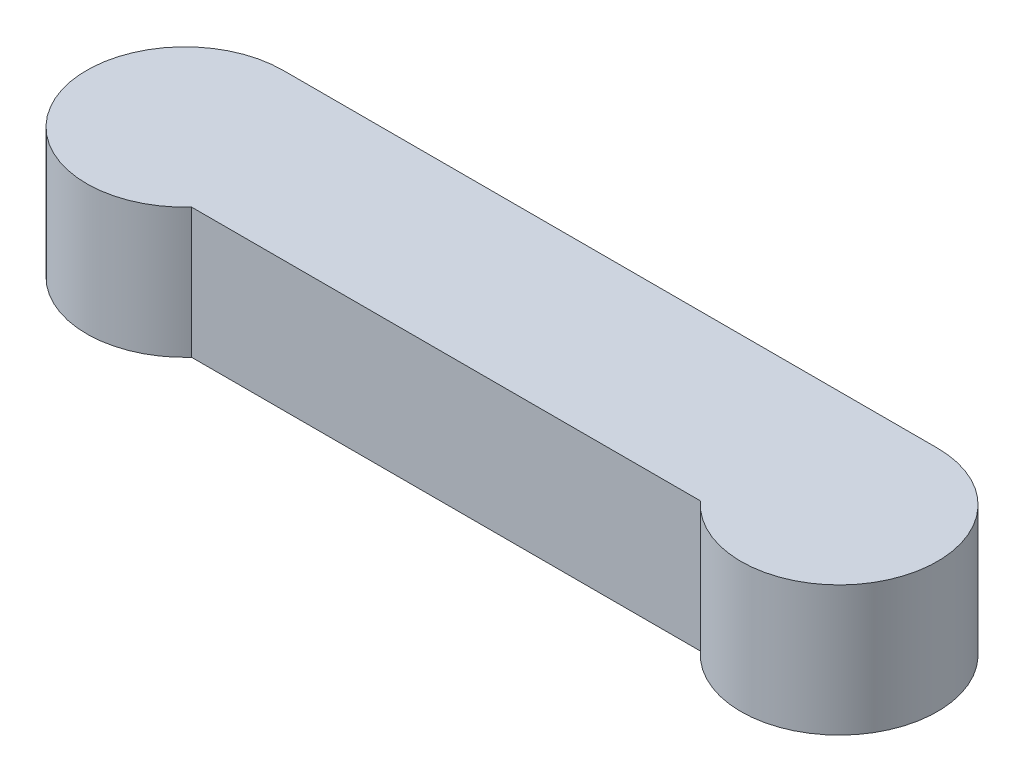
ISO-10303-21;
HEADER;
FILE_DESCRIPTION(('STEP AP214'),'2;1');
FILE_NAME('part.step','',(''),(''),'','','');
FILE_SCHEMA(('AUTOMOTIVE_DESIGN { 1 0 10303 214 1 1 1 1 }'));
ENDSEC;
DATA;
#1=APPLICATION_CONTEXT('core data for automotive mechanical design processes');
#2=APPLICATION_PROTOCOL_DEFINITION('international standard','automotive_design',2000,#1);
#3=PRODUCT_CONTEXT('',#1,'mechanical');
#4=PRODUCT('Part','Part','',(#3));
#5=PRODUCT_RELATED_PRODUCT_CATEGORY('part','',(#4));
#6=PRODUCT_DEFINITION_FORMATION('','',#4);
#7=PRODUCT_DEFINITION_CONTEXT('part definition',#1,'design');
#8=PRODUCT_DEFINITION('design','',#6,#7);
#9=PRODUCT_DEFINITION_SHAPE('','',#8);
#10=(LENGTH_UNIT() NAMED_UNIT(*) SI_UNIT(.MILLI.,.METRE.));
#11=(NAMED_UNIT(*) PLANE_ANGLE_UNIT() SI_UNIT($,.RADIAN.));
#12=(NAMED_UNIT(*) SI_UNIT($,.STERADIAN.) SOLID_ANGLE_UNIT());
#13=UNCERTAINTY_MEASURE_WITH_UNIT(LENGTH_MEASURE(1.E-05),#10,'distance_accuracy_value','');
#14=(GEOMETRIC_REPRESENTATION_CONTEXT(3) GLOBAL_UNCERTAINTY_ASSIGNED_CONTEXT((#13)) GLOBAL_UNIT_ASSIGNED_CONTEXT((#10,
#11,#12)) REPRESENTATION_CONTEXT('',''));
#15=CARTESIAN_POINT('',(0.,0.,0.));
#16=DIRECTION('',(0.,0.,1.));
#17=DIRECTION('',(1.,0.,0.));
#18=AXIS2_PLACEMENT_3D('',#15,#16,#17);
#19=CARTESIAN_POINT('',(-41.5000000000001,40.399999972,0.));
#20=DIRECTION('',(0.,-1.,0.));
#21=DIRECTION('',(0.,0.,-1.));
#22=AXIS2_PLACEMENT_3D('',#19,#20,#21);
#23=CYLINDRICAL_SURFACE('',#22,30.5);
#24=CARTESIAN_POINT('',(-41.5000000000001,0.,0.));
#25=DIRECTION('',(0.,1.,0.));
#26=DIRECTION('',(0.,0.,1.));
#27=AXIS2_PLACEMENT_3D('',#24,#25,#26);
#28=CIRCLE('',#27,30.5);
#29=CARTESIAN_POINT('',(-41.5000000000001,0.,-30.5));
#30=VERTEX_POINT('',#29);
#31=CARTESIAN_POINT('',(-18.9168204187277,0.,20.5));
#32=VERTEX_POINT('',#31);
#33=EDGE_CURVE('E96',#30,#32,#28,.T.);
#34=ORIENTED_EDGE('',*,*,#33,.T.);
#35=DIRECTION('',(0.,-1.,0.));
#36=VECTOR('',#35,1.);
#37=CARTESIAN_POINT('',(-18.9168204187277,40.399999972,20.5));
#38=LINE('',#37,#36);
#39=CARTESIAN_POINT('',(-18.9168204187277,40.399999972,20.5));
#40=VERTEX_POINT('',#39);
#41=EDGE_CURVE('E11',#40,#32,#38,.T.);
#42=ORIENTED_EDGE('',*,*,#41,.F.);
#43=CARTESIAN_POINT('',(-41.5000000000001,40.399999972,0.));
#44=DIRECTION('',(0.,1.,0.));
#45=DIRECTION('',(0.,0.,1.));
#46=AXIS2_PLACEMENT_3D('',#43,#44,#45);
#47=CIRCLE('',#46,30.5);
#48=CARTESIAN_POINT('',(-41.5000000000001,40.399999972,-30.5));
#49=VERTEX_POINT('',#48);
#50=EDGE_CURVE('E84',#49,#40,#47,.T.);
#51=ORIENTED_EDGE('',*,*,#50,.F.);
#52=DIRECTION('',(0.,-1.,0.));
#53=VECTOR('',#52,1.);
#54=CARTESIAN_POINT('',(-41.5000000000001,40.399999972,-30.5));
#55=LINE('',#54,#53);
#56=EDGE_CURVE('E92',#49,#30,#55,.T.);
#57=ORIENTED_EDGE('',*,*,#56,.T.);
#58=EDGE_LOOP('',(#34,#42,#51,#57));
#59=FACE_BOUND('',#58,.T.);
#60=ADVANCED_FACE('F33',(#59),#23,.T.);
#61=CARTESIAN_POINT('',(-18.9168204187277,40.399999972,20.5));
#62=DIRECTION('',(0.,0.,-1.));
#63=DIRECTION('',(-1.,0.,0.));
#64=AXIS2_PLACEMENT_3D('',#61,#62,#63);
#65=PLANE('',#64);
#66=DIRECTION('',(1.,0.,0.));
#67=VECTOR('',#66,1.);
#68=CARTESIAN_POINT('',(-18.9168204187277,0.,20.5));
#69=LINE('',#68,#67);
#70=CARTESIAN_POINT('',(139.116820418727,0.,20.5000000000001));
#71=VERTEX_POINT('',#70);
#72=EDGE_CURVE('E88',#32,#71,#69,.T.);
#73=ORIENTED_EDGE('',*,*,#72,.T.);
#74=DIRECTION('',(0.,-1.,0.));
#75=VECTOR('',#74,1.);
#76=CARTESIAN_POINT('',(139.116820418727,40.399999972,20.5000000000001));
#77=LINE('',#76,#75);
#78=CARTESIAN_POINT('',(139.116820418727,40.399999972,20.5000000000001));
#79=VERTEX_POINT('',#78);
#80=EDGE_CURVE('E41',#79,#71,#77,.T.);
#81=ORIENTED_EDGE('',*,*,#80,.F.);
#82=DIRECTION('',(1.,0.,0.));
#83=VECTOR('',#82,1.);
#84=CARTESIAN_POINT('',(-18.9168204187277,40.399999972,20.5));
#85=LINE('',#84,#83);
#86=EDGE_CURVE('E79',#40,#79,#85,.T.);
#87=ORIENTED_EDGE('',*,*,#86,.F.);
#88=ORIENTED_EDGE('',*,*,#41,.T.);
#89=EDGE_LOOP('',(#73,#81,#87,#88));
#90=FACE_BOUND('',#89,.T.);
#91=ADVANCED_FACE('F87',(#90),#65,.F.);
#92=CARTESIAN_POINT('',(161.7,40.399999972,0.));
#93=DIRECTION('',(0.,-1.,0.));
#94=DIRECTION('',(0.,0.,-1.));
#95=AXIS2_PLACEMENT_3D('',#92,#93,#94);
#96=CYLINDRICAL_SURFACE('',#95,30.5);
#97=CARTESIAN_POINT('',(161.7,0.,0.));
#98=DIRECTION('',(0.,1.,0.));
#99=DIRECTION('',(0.,0.,1.));
#100=AXIS2_PLACEMENT_3D('',#97,#98,#99);
#101=CIRCLE('',#100,30.5);
#102=CARTESIAN_POINT('',(161.7,0.,-30.4999999999999));
#103=VERTEX_POINT('',#102);
#104=EDGE_CURVE('E66',#71,#103,#101,.T.);
#105=ORIENTED_EDGE('',*,*,#104,.T.);
#106=DIRECTION('',(0.,-1.,0.));
#107=VECTOR('',#106,1.);
#108=CARTESIAN_POINT('',(161.7,40.399999972,-30.4999999999999));
#109=LINE('',#108,#107);
#110=CARTESIAN_POINT('',(161.7,40.399999972,-30.4999999999999));
#111=VERTEX_POINT('',#110);
#112=EDGE_CURVE('E89',#111,#103,#109,.T.);
#113=ORIENTED_EDGE('',*,*,#112,.F.);
#114=CARTESIAN_POINT('',(161.7,40.399999972,0.));
#115=DIRECTION('',(0.,1.,0.));
#116=DIRECTION('',(0.,0.,1.));
#117=AXIS2_PLACEMENT_3D('',#114,#115,#116);
#118=CIRCLE('',#117,30.5);
#119=EDGE_CURVE('E82',#79,#111,#118,.T.);
#120=ORIENTED_EDGE('',*,*,#119,.F.);
#121=ORIENTED_EDGE('',*,*,#80,.T.);
#122=EDGE_LOOP('',(#105,#113,#120,#121));
#123=FACE_BOUND('',#122,.T.);
#124=ADVANCED_FACE('F90',(#123),#96,.T.);
#125=CARTESIAN_POINT('',(161.7,40.399999972,-30.4999999999999));
#126=DIRECTION('',(0.,0.,1.));
#127=DIRECTION('',(1.,0.,0.));
#128=AXIS2_PLACEMENT_3D('',#125,#126,#127);
#129=PLANE('',#128);
#130=DIRECTION('',(-1.,0.,0.));
#131=VECTOR('',#130,1.);
#132=CARTESIAN_POINT('',(161.7,0.,-30.4999999999999));
#133=LINE('',#132,#131);
#134=EDGE_CURVE('E72',#103,#30,#133,.T.);
#135=ORIENTED_EDGE('',*,*,#134,.T.);
#136=ORIENTED_EDGE('',*,*,#56,.F.);
#137=DIRECTION('',(-1.,0.,0.));
#138=VECTOR('',#137,1.);
#139=CARTESIAN_POINT('',(161.7,40.399999972,-30.4999999999999));
#140=LINE('',#139,#138);
#141=EDGE_CURVE('E49',#111,#49,#140,.T.);
#142=ORIENTED_EDGE('',*,*,#141,.F.);
#143=ORIENTED_EDGE('',*,*,#112,.T.);
#144=EDGE_LOOP('',(#135,#136,#142,#143));
#145=FACE_BOUND('',#144,.T.);
#146=ADVANCED_FACE('F103',(#145),#129,.F.);
#147=CARTESIAN_POINT('',(-41.5000000000001,40.399999972,0.));
#148=DIRECTION('',(0.,1.,0.));
#149=DIRECTION('',(0.,0.,1.));
#150=AXIS2_PLACEMENT_3D('',#147,#148,#149);
#151=PLANE('',#150);
#152=ORIENTED_EDGE('',*,*,#50,.T.);
#153=ORIENTED_EDGE('',*,*,#86,.T.);
#154=ORIENTED_EDGE('',*,*,#119,.T.);
#155=ORIENTED_EDGE('',*,*,#141,.T.);
#156=EDGE_LOOP('',(#152,#153,#154,#155));
#157=FACE_BOUND('',#156,.T.);
#158=ADVANCED_FACE('F80',(#157),#151,.T.);
#159=CARTESIAN_POINT('',(-41.5000000000001,0.,0.));
#160=DIRECTION('',(0.,1.,0.));
#161=DIRECTION('',(0.,0.,1.));
#162=AXIS2_PLACEMENT_3D('',#159,#160,#161);
#163=PLANE('',#162);
#164=ORIENTED_EDGE('',*,*,#33,.F.);
#165=ORIENTED_EDGE('',*,*,#134,.F.);
#166=ORIENTED_EDGE('',*,*,#104,.F.);
#167=ORIENTED_EDGE('',*,*,#72,.F.);
#168=EDGE_LOOP('',(#164,#165,#166,#167));
#169=FACE_BOUND('',#168,.T.);
#170=ADVANCED_FACE('F106',(#169),#163,.F.);
#171=CLOSED_SHELL('',(#60,#91,#124,#146,#158,#170));
#172=MANIFOLD_SOLID_BREP('B2',#171);
#173=ADVANCED_BREP_SHAPE_REPRESENTATION('',(#18,#172),#14);
#174=SHAPE_DEFINITION_REPRESENTATION(#9,#173);
ENDSEC;
END-ISO-10303-21;
